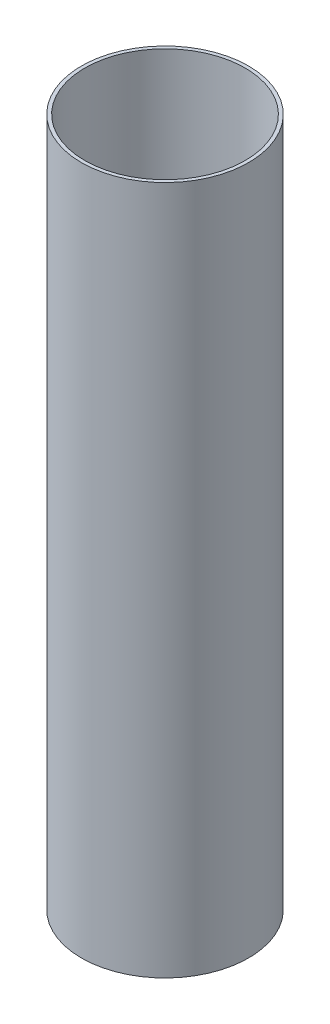
ISO-10303-21;
HEADER;
FILE_DESCRIPTION(('STEP AP214'),'2;1');
FILE_NAME('part.step','',(''),(''),'','','');
FILE_SCHEMA(('AUTOMOTIVE_DESIGN { 1 0 10303 214 1 1 1 1 }'));
ENDSEC;
DATA;
#1=APPLICATION_CONTEXT('core data for automotive mechanical design processes');
#2=APPLICATION_PROTOCOL_DEFINITION('international standard','automotive_design',2000,#1);
#3=PRODUCT_CONTEXT('',#1,'mechanical');
#4=PRODUCT('Part','Part','',(#3));
#5=PRODUCT_RELATED_PRODUCT_CATEGORY('part','',(#4));
#6=PRODUCT_DEFINITION_FORMATION('','',#4);
#7=PRODUCT_DEFINITION_CONTEXT('part definition',#1,'design');
#8=PRODUCT_DEFINITION('design','',#6,#7);
#9=PRODUCT_DEFINITION_SHAPE('','',#8);
#10=(LENGTH_UNIT() NAMED_UNIT(*) SI_UNIT(.MILLI.,.METRE.));
#11=(NAMED_UNIT(*) PLANE_ANGLE_UNIT() SI_UNIT($,.RADIAN.));
#12=(NAMED_UNIT(*) SI_UNIT($,.STERADIAN.) SOLID_ANGLE_UNIT());
#13=UNCERTAINTY_MEASURE_WITH_UNIT(LENGTH_MEASURE(1.E-05),#10,'distance_accuracy_value','');
#14=(GEOMETRIC_REPRESENTATION_CONTEXT(3) GLOBAL_UNCERTAINTY_ASSIGNED_CONTEXT((#13)) GLOBAL_UNIT_ASSIGNED_CONTEXT((#10,
#11,#12)) REPRESENTATION_CONTEXT('',''));
#15=CARTESIAN_POINT('',(0.,0.,0.));
#16=DIRECTION('',(0.,0.,1.));
#17=DIRECTION('',(1.,0.,0.));
#18=AXIS2_PLACEMENT_3D('',#15,#16,#17);
#19=CARTESIAN_POINT('',(0.,700.,0.));
#20=DIRECTION('',(0.,-1.,0.));
#21=DIRECTION('',(0.,0.,-1.));
#22=AXIS2_PLACEMENT_3D('',#19,#20,#21);
#23=CYLINDRICAL_SURFACE('',#22,85.);
#24=CARTESIAN_POINT('',(0.,700.,0.));
#25=DIRECTION('',(0.,1.,0.));
#26=DIRECTION('',(0.,0.,1.));
#27=AXIS2_PLACEMENT_3D('',#24,#25,#26);
#28=CIRCLE('',#27,85.);
#29=CARTESIAN_POINT('',(0.,700.,85.));
#30=VERTEX_POINT('',#29);
#31=EDGE_CURVE('E10',#30,#30,#28,.T.);
#32=ORIENTED_EDGE('',*,*,#31,.F.);
#33=EDGE_LOOP('',(#32));
#34=FACE_BOUND('',#33,.T.);
#35=CARTESIAN_POINT('',(0.,0.,0.));
#36=DIRECTION('',(0.,1.,0.));
#37=DIRECTION('',(0.,0.,1.));
#38=AXIS2_PLACEMENT_3D('',#35,#36,#37);
#39=CIRCLE('',#38,85.);
#40=CARTESIAN_POINT('',(0.,0.,85.));
#41=VERTEX_POINT('',#40);
#42=EDGE_CURVE('E34',#41,#41,#39,.T.);
#43=ORIENTED_EDGE('',*,*,#42,.T.);
#44=EDGE_LOOP('',(#43));
#45=FACE_BOUND('',#44,.T.);
#46=ADVANCED_FACE('F31',(#34,#45),#23,.T.);
#47=CARTESIAN_POINT('',(0.,700.,0.));
#48=DIRECTION('',(0.,1.,0.));
#49=DIRECTION('',(0.,0.,1.));
#50=AXIS2_PLACEMENT_3D('',#47,#48,#49);
#51=PLANE('',#50);
#52=CARTESIAN_POINT('',(0.,700.,0.));
#53=DIRECTION('',(0.,1.,0.));
#54=DIRECTION('',(0.,0.,1.));
#55=AXIS2_PLACEMENT_3D('',#52,#53,#54);
#56=CIRCLE('',#55,81.5);
#57=CARTESIAN_POINT('',(0.,700.,81.5));
#58=VERTEX_POINT('',#57);
#59=EDGE_CURVE('E41',#58,#58,#56,.T.);
#60=ORIENTED_EDGE('',*,*,#59,.F.);
#61=EDGE_LOOP('',(#60));
#62=FACE_BOUND('',#61,.T.);
#63=ORIENTED_EDGE('',*,*,#31,.T.);
#64=EDGE_LOOP('',(#63));
#65=FACE_BOUND('',#64,.T.);
#66=ADVANCED_FACE('F61',(#62,#65),#51,.T.);
#67=CARTESIAN_POINT('',(0.,0.,0.));
#68=DIRECTION('',(0.,1.,0.));
#69=DIRECTION('',(0.,0.,1.));
#70=AXIS2_PLACEMENT_3D('',#67,#68,#69);
#71=PLANE('',#70);
#72=ORIENTED_EDGE('',*,*,#42,.F.);
#73=EDGE_LOOP('',(#72));
#74=FACE_BOUND('',#73,.T.);
#75=ADVANCED_FACE('F53',(#74),#71,.F.);
#76=CARTESIAN_POINT('',(0.,700.,0.));
#77=DIRECTION('',(0.,-1.,0.));
#78=DIRECTION('',(0.,0.,-1.));
#79=AXIS2_PLACEMENT_3D('',#76,#77,#78);
#80=CYLINDRICAL_SURFACE('',#79,81.5);
#81=ORIENTED_EDGE('',*,*,#59,.T.);
#82=EDGE_LOOP('',(#81));
#83=FACE_BOUND('',#82,.T.);
#84=CARTESIAN_POINT('',(0.,3.49999999999995,0.));
#85=DIRECTION('',(0.,1.,0.));
#86=DIRECTION('',(0.,0.,1.));
#87=AXIS2_PLACEMENT_3D('',#84,#85,#86);
#88=CIRCLE('',#87,81.5);
#89=CARTESIAN_POINT('',(0.,3.49999999999995,81.5));
#90=VERTEX_POINT('',#89);
#91=EDGE_CURVE('E45',#90,#90,#88,.T.);
#92=ORIENTED_EDGE('',*,*,#91,.F.);
#93=EDGE_LOOP('',(#92));
#94=FACE_BOUND('',#93,.T.);
#95=ADVANCED_FACE('F51',(#83,#94),#80,.F.);
#96=CARTESIAN_POINT('',(0.,3.5,0.));
#97=DIRECTION('',(0.,1.,0.));
#98=DIRECTION('',(0.,0.,1.));
#99=AXIS2_PLACEMENT_3D('',#96,#97,#98);
#100=PLANE('',#99);
#101=ORIENTED_EDGE('',*,*,#91,.T.);
#102=EDGE_LOOP('',(#101));
#103=FACE_BOUND('',#102,.T.);
#104=ADVANCED_FACE('F49',(#103),#100,.T.);
#105=CLOSED_SHELL('',(#46,#66,#75,#95,#104));
#106=MANIFOLD_SOLID_BREP('B2',#105);
#107=ADVANCED_BREP_SHAPE_REPRESENTATION('',(#18,#106),#14);
#108=SHAPE_DEFINITION_REPRESENTATION(#9,#107);
ENDSEC;
END-ISO-10303-21;
